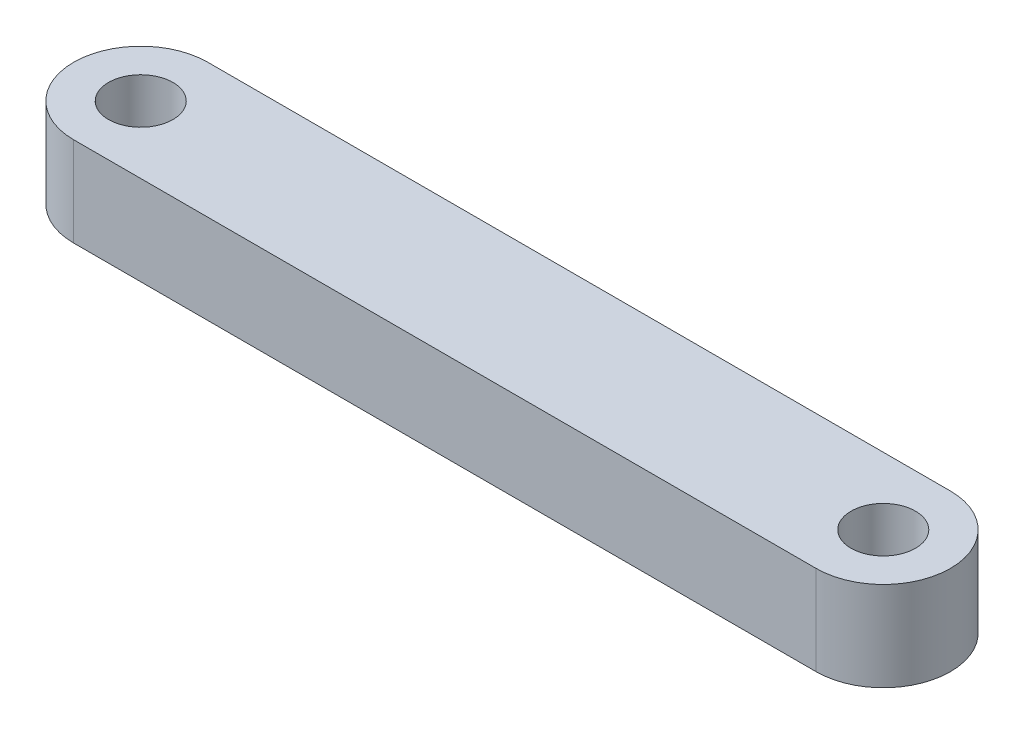
ISO-10303-21;
HEADER;
FILE_DESCRIPTION(('STEP AP214'),'2;1');
FILE_NAME('part.step','',(''),(''),'','','');
FILE_SCHEMA(('AUTOMOTIVE_DESIGN { 1 0 10303 214 1 1 1 1 }'));
ENDSEC;
DATA;
#1=APPLICATION_CONTEXT('core data for automotive mechanical design processes');
#2=APPLICATION_PROTOCOL_DEFINITION('international standard','automotive_design',2000,#1);
#3=PRODUCT_CONTEXT('',#1,'mechanical');
#4=PRODUCT('Part','Part','',(#3));
#5=PRODUCT_RELATED_PRODUCT_CATEGORY('part','',(#4));
#6=PRODUCT_DEFINITION_FORMATION('','',#4);
#7=PRODUCT_DEFINITION_CONTEXT('part definition',#1,'design');
#8=PRODUCT_DEFINITION('design','',#6,#7);
#9=PRODUCT_DEFINITION_SHAPE('','',#8);
#10=(LENGTH_UNIT() NAMED_UNIT(*) SI_UNIT(.MILLI.,.METRE.));
#11=(NAMED_UNIT(*) PLANE_ANGLE_UNIT() SI_UNIT($,.RADIAN.));
#12=(NAMED_UNIT(*) SI_UNIT($,.STERADIAN.) SOLID_ANGLE_UNIT());
#13=UNCERTAINTY_MEASURE_WITH_UNIT(LENGTH_MEASURE(1.E-05),#10,'distance_accuracy_value','');
#14=(GEOMETRIC_REPRESENTATION_CONTEXT(3) GLOBAL_UNCERTAINTY_ASSIGNED_CONTEXT((#13)) GLOBAL_UNIT_ASSIGNED_CONTEXT((#10,
#11,#12)) REPRESENTATION_CONTEXT('',''));
#15=CARTESIAN_POINT('',(0.,0.,0.));
#16=DIRECTION('',(0.,0.,1.));
#17=DIRECTION('',(1.,0.,0.));
#18=AXIS2_PLACEMENT_3D('',#15,#16,#17);
#19=CARTESIAN_POINT('',(0.,6.35,0.));
#20=DIRECTION('',(0.,1.,0.));
#21=DIRECTION('',(0.,0.,1.));
#22=AXIS2_PLACEMENT_3D('',#19,#20,#21);
#23=PLANE('',#22);
#24=CARTESIAN_POINT('',(0.,6.35,0.));
#25=DIRECTION('',(0.,1.,0.));
#26=DIRECTION('',(0.,0.,1.));
#27=AXIS2_PLACEMENT_3D('',#24,#25,#26);
#28=CIRCLE('',#27,2.286);
#29=CARTESIAN_POINT('',(0.,6.35,2.286));
#30=VERTEX_POINT('',#29);
#31=EDGE_CURVE('E129',#30,#30,#28,.T.);
#32=ORIENTED_EDGE('',*,*,#31,.F.);
#33=EDGE_LOOP('',(#32));
#34=FACE_BOUND('',#33,.T.);
#35=CARTESIAN_POINT('',(0.,6.35,0.));
#36=DIRECTION('',(0.,1.,0.));
#37=DIRECTION('',(0.,0.,1.));
#38=AXIS2_PLACEMENT_3D('',#35,#36,#37);
#39=CIRCLE('',#38,4.7625);
#40=CARTESIAN_POINT('',(0.,6.35,4.7625));
#41=VERTEX_POINT('',#40);
#42=CARTESIAN_POINT('',(0.,6.35,-4.7625));
#43=VERTEX_POINT('',#42);
#44=EDGE_CURVE('E108',#41,#43,#39,.T.);
#45=ORIENTED_EDGE('',*,*,#44,.T.);
#46=DIRECTION('',(-1.,0.,0.));
#47=VECTOR('',#46,1.);
#48=CARTESIAN_POINT('',(0.,6.35,-4.7625));
#49=LINE('',#48,#47);
#50=CARTESIAN_POINT('',(-52.705,6.35,-4.76249999999999));
#51=VERTEX_POINT('',#50);
#52=EDGE_CURVE('E103',#43,#51,#49,.T.);
#53=ORIENTED_EDGE('',*,*,#52,.T.);
#54=CARTESIAN_POINT('',(-52.705,6.35,0.));
#55=DIRECTION('',(0.,1.,0.));
#56=DIRECTION('',(0.,0.,1.));
#57=AXIS2_PLACEMENT_3D('',#54,#55,#56);
#58=CIRCLE('',#57,4.7625);
#59=CARTESIAN_POINT('',(-52.705,6.35,4.76250000000001));
#60=VERTEX_POINT('',#59);
#61=EDGE_CURVE('E106',#51,#60,#58,.T.);
#62=ORIENTED_EDGE('',*,*,#61,.T.);
#63=DIRECTION('',(1.,0.,0.));
#64=VECTOR('',#63,1.);
#65=CARTESIAN_POINT('',(0.,6.35,4.7625));
#66=LINE('',#65,#64);
#67=EDGE_CURVE('E68',#60,#41,#66,.T.);
#68=ORIENTED_EDGE('',*,*,#67,.T.);
#69=EDGE_LOOP('',(#45,#53,#62,#68));
#70=FACE_BOUND('',#69,.T.);
#71=CARTESIAN_POINT('',(-52.705,6.35,0.));
#72=DIRECTION('',(0.,1.,0.));
#73=DIRECTION('',(0.,0.,1.));
#74=AXIS2_PLACEMENT_3D('',#71,#72,#73);
#75=CIRCLE('',#74,2.286);
#76=CARTESIAN_POINT('',(-52.705,6.35,2.28600000000001));
#77=VERTEX_POINT('',#76);
#78=EDGE_CURVE('E150',#77,#77,#75,.T.);
#79=ORIENTED_EDGE('',*,*,#78,.F.);
#80=EDGE_LOOP('',(#79));
#81=FACE_BOUND('',#80,.T.);
#82=ADVANCED_FACE('F47',(#34,#70,#81),#23,.T.);
#83=CARTESIAN_POINT('',(0.,0.,0.));
#84=DIRECTION('',(0.,1.,0.));
#85=DIRECTION('',(0.,0.,1.));
#86=AXIS2_PLACEMENT_3D('',#83,#84,#85);
#87=PLANE('',#86);
#88=CARTESIAN_POINT('',(0.,0.,0.));
#89=DIRECTION('',(0.,1.,0.));
#90=DIRECTION('',(0.,0.,1.));
#91=AXIS2_PLACEMENT_3D('',#88,#89,#90);
#92=CIRCLE('',#91,4.7625);
#93=CARTESIAN_POINT('',(0.,0.,4.7625));
#94=VERTEX_POINT('',#93);
#95=CARTESIAN_POINT('',(0.,0.,-4.7625));
#96=VERTEX_POINT('',#95);
#97=EDGE_CURVE('E125',#94,#96,#92,.T.);
#98=ORIENTED_EDGE('',*,*,#97,.F.);
#99=DIRECTION('',(1.,0.,0.));
#100=VECTOR('',#99,1.);
#101=CARTESIAN_POINT('',(0.,0.,4.7625));
#102=LINE('',#101,#100);
#103=CARTESIAN_POINT('',(-52.705,0.,4.76250000000001));
#104=VERTEX_POINT('',#103);
#105=EDGE_CURVE('E95',#104,#94,#102,.T.);
#106=ORIENTED_EDGE('',*,*,#105,.F.);
#107=CARTESIAN_POINT('',(-52.705,0.,0.));
#108=DIRECTION('',(0.,1.,0.));
#109=DIRECTION('',(0.,0.,1.));
#110=AXIS2_PLACEMENT_3D('',#107,#108,#109);
#111=CIRCLE('',#110,4.7625);
#112=CARTESIAN_POINT('',(-52.705,0.,-4.76249999999999));
#113=VERTEX_POINT('',#112);
#114=EDGE_CURVE('E89',#113,#104,#111,.T.);
#115=ORIENTED_EDGE('',*,*,#114,.F.);
#116=DIRECTION('',(-1.,0.,0.));
#117=VECTOR('',#116,1.);
#118=CARTESIAN_POINT('',(0.,0.,-4.7625));
#119=LINE('',#118,#117);
#120=EDGE_CURVE('E113',#96,#113,#119,.T.);
#121=ORIENTED_EDGE('',*,*,#120,.F.);
#122=EDGE_LOOP('',(#98,#106,#115,#121));
#123=FACE_BOUND('',#122,.T.);
#124=CARTESIAN_POINT('',(0.,0.,0.));
#125=DIRECTION('',(0.,1.,0.));
#126=DIRECTION('',(0.,0.,1.));
#127=AXIS2_PLACEMENT_3D('',#124,#125,#126);
#128=CIRCLE('',#127,2.286);
#129=CARTESIAN_POINT('',(0.,0.,2.286));
#130=VERTEX_POINT('',#129);
#131=EDGE_CURVE('E147',#130,#130,#128,.T.);
#132=ORIENTED_EDGE('',*,*,#131,.T.);
#133=EDGE_LOOP('',(#132));
#134=FACE_BOUND('',#133,.T.);
#135=CARTESIAN_POINT('',(-52.705,0.,0.));
#136=DIRECTION('',(0.,1.,0.));
#137=DIRECTION('',(0.,0.,1.));
#138=AXIS2_PLACEMENT_3D('',#135,#136,#137);
#139=CIRCLE('',#138,2.286);
#140=CARTESIAN_POINT('',(-52.705,0.,2.28600000000001));
#141=VERTEX_POINT('',#140);
#142=EDGE_CURVE('E154',#141,#141,#139,.T.);
#143=ORIENTED_EDGE('',*,*,#142,.T.);
#144=EDGE_LOOP('',(#143));
#145=FACE_BOUND('',#144,.T.);
#146=ADVANCED_FACE('F141',(#123,#134,#145),#87,.F.);
#147=CARTESIAN_POINT('',(0.,6.35,0.));
#148=DIRECTION('',(0.,-1.,0.));
#149=DIRECTION('',(0.,0.,-1.));
#150=AXIS2_PLACEMENT_3D('',#147,#148,#149);
#151=CYLINDRICAL_SURFACE('',#150,4.7625);
#152=ORIENTED_EDGE('',*,*,#97,.T.);
#153=DIRECTION('',(0.,-1.,0.));
#154=VECTOR('',#153,1.);
#155=CARTESIAN_POINT('',(0.,6.35,-4.7625));
#156=LINE('',#155,#154);
#157=EDGE_CURVE('E11',#43,#96,#156,.T.);
#158=ORIENTED_EDGE('',*,*,#157,.F.);
#159=ORIENTED_EDGE('',*,*,#44,.F.);
#160=DIRECTION('',(0.,-1.,0.));
#161=VECTOR('',#160,1.);
#162=CARTESIAN_POINT('',(0.,6.35,4.7625));
#163=LINE('',#162,#161);
#164=EDGE_CURVE('E121',#41,#94,#163,.T.);
#165=ORIENTED_EDGE('',*,*,#164,.T.);
#166=EDGE_LOOP('',(#152,#158,#159,#165));
#167=FACE_BOUND('',#166,.T.);
#168=ADVANCED_FACE('F49',(#167),#151,.T.);
#169=CARTESIAN_POINT('',(0.,6.35,-4.7625));
#170=DIRECTION('',(0.,0.,1.));
#171=DIRECTION('',(1.,0.,0.));
#172=AXIS2_PLACEMENT_3D('',#169,#170,#171);
#173=PLANE('',#172);
#174=ORIENTED_EDGE('',*,*,#120,.T.);
#175=DIRECTION('',(0.,-1.,0.));
#176=VECTOR('',#175,1.);
#177=CARTESIAN_POINT('',(-52.705,6.35,-4.76249999999999));
#178=LINE('',#177,#176);
#179=EDGE_CURVE('E57',#51,#113,#178,.T.);
#180=ORIENTED_EDGE('',*,*,#179,.F.);
#181=ORIENTED_EDGE('',*,*,#52,.F.);
#182=ORIENTED_EDGE('',*,*,#157,.T.);
#183=EDGE_LOOP('',(#174,#180,#181,#182));
#184=FACE_BOUND('',#183,.T.);
#185=ADVANCED_FACE('F112',(#184),#173,.F.);
#186=CARTESIAN_POINT('',(-52.705,6.35,0.));
#187=DIRECTION('',(0.,-1.,0.));
#188=DIRECTION('',(0.,0.,-1.));
#189=AXIS2_PLACEMENT_3D('',#186,#187,#188);
#190=CYLINDRICAL_SURFACE('',#189,4.7625);
#191=ORIENTED_EDGE('',*,*,#114,.T.);
#192=DIRECTION('',(0.,-1.,0.));
#193=VECTOR('',#192,1.);
#194=CARTESIAN_POINT('',(-52.705,6.35,4.76250000000001));
#195=LINE('',#194,#193);
#196=EDGE_CURVE('E115',#60,#104,#195,.T.);
#197=ORIENTED_EDGE('',*,*,#196,.F.);
#198=ORIENTED_EDGE('',*,*,#61,.F.);
#199=ORIENTED_EDGE('',*,*,#179,.T.);
#200=EDGE_LOOP('',(#191,#197,#198,#199));
#201=FACE_BOUND('',#200,.T.);
#202=ADVANCED_FACE('F116',(#201),#190,.T.);
#203=CARTESIAN_POINT('',(0.,6.35,4.7625));
#204=DIRECTION('',(0.,0.,-1.));
#205=DIRECTION('',(-1.,0.,0.));
#206=AXIS2_PLACEMENT_3D('',#203,#204,#205);
#207=PLANE('',#206);
#208=ORIENTED_EDGE('',*,*,#105,.T.);
#209=ORIENTED_EDGE('',*,*,#164,.F.);
#210=ORIENTED_EDGE('',*,*,#67,.F.);
#211=ORIENTED_EDGE('',*,*,#196,.T.);
#212=EDGE_LOOP('',(#208,#209,#210,#211));
#213=FACE_BOUND('',#212,.T.);
#214=ADVANCED_FACE('F138',(#213),#207,.F.);
#215=CARTESIAN_POINT('',(0.,6.35,0.));
#216=DIRECTION('',(0.,-1.,0.));
#217=DIRECTION('',(0.,0.,-1.));
#218=AXIS2_PLACEMENT_3D('',#215,#216,#217);
#219=CYLINDRICAL_SURFACE('',#218,2.286);
#220=ORIENTED_EDGE('',*,*,#31,.T.);
#221=EDGE_LOOP('',(#220));
#222=FACE_BOUND('',#221,.T.);
#223=ORIENTED_EDGE('',*,*,#131,.F.);
#224=EDGE_LOOP('',(#223));
#225=FACE_BOUND('',#224,.T.);
#226=ADVANCED_FACE('F172',(#222,#225),#219,.F.);
#227=CARTESIAN_POINT('',(-52.705,6.35,0.));
#228=DIRECTION('',(0.,-1.,0.));
#229=DIRECTION('',(0.,0.,-1.));
#230=AXIS2_PLACEMENT_3D('',#227,#228,#229);
#231=CYLINDRICAL_SURFACE('',#230,2.286);
#232=ORIENTED_EDGE('',*,*,#78,.T.);
#233=EDGE_LOOP('',(#232));
#234=FACE_BOUND('',#233,.T.);
#235=ORIENTED_EDGE('',*,*,#142,.F.);
#236=EDGE_LOOP('',(#235));
#237=FACE_BOUND('',#236,.T.);
#238=ADVANCED_FACE('F162',(#234,#237),#231,.F.);
#239=CLOSED_SHELL('',(#82,#146,#168,#185,#202,#214,#226,#238));
#240=MANIFOLD_SOLID_BREP('B2',#239);
#241=ADVANCED_BREP_SHAPE_REPRESENTATION('',(#18,#240),#14);
#242=SHAPE_DEFINITION_REPRESENTATION(#9,#241);
ENDSEC;
END-ISO-10303-21;
